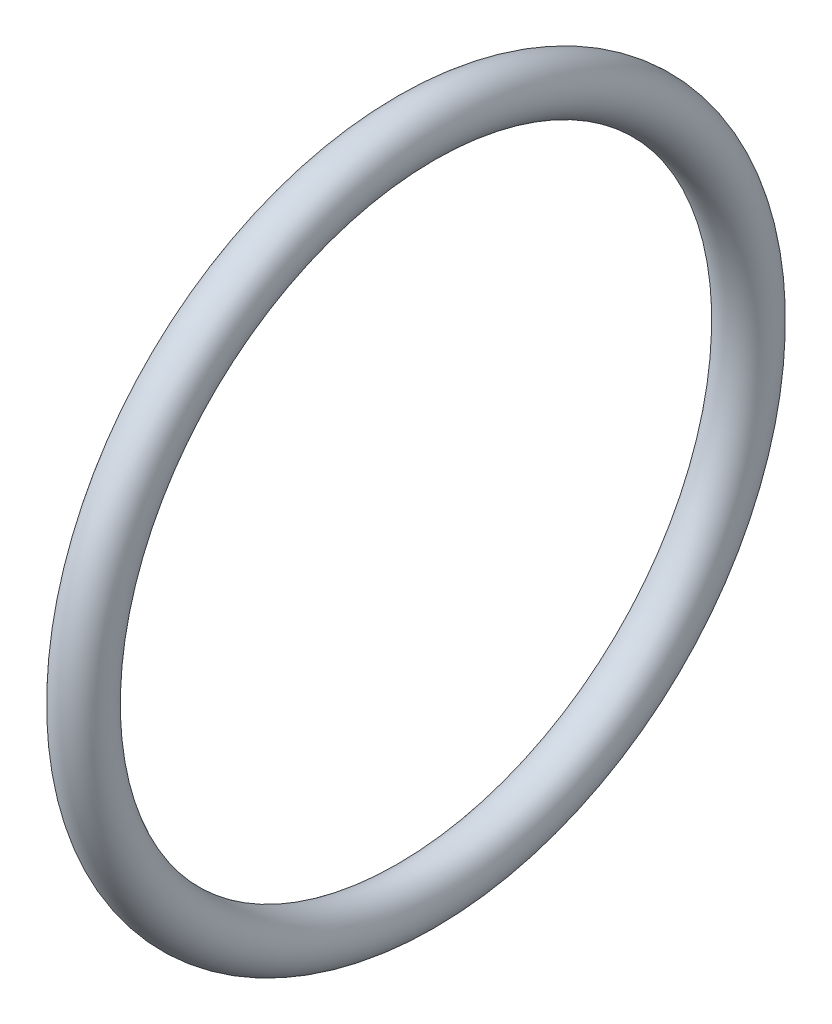
ISO-10303-21;
HEADER;
FILE_DESCRIPTION(('STEP AP214'),'2;1');
FILE_NAME('part.step','',(''),(''),'','','');
FILE_SCHEMA(('AUTOMOTIVE_DESIGN { 1 0 10303 214 1 1 1 1 }'));
ENDSEC;
DATA;
#1=APPLICATION_CONTEXT('core data for automotive mechanical design processes');
#2=APPLICATION_PROTOCOL_DEFINITION('international standard','automotive_design',2000,#1);
#3=PRODUCT_CONTEXT('',#1,'mechanical');
#4=PRODUCT('Part','Part','',(#3));
#5=PRODUCT_RELATED_PRODUCT_CATEGORY('part','',(#4));
#6=PRODUCT_DEFINITION_FORMATION('','',#4);
#7=PRODUCT_DEFINITION_CONTEXT('part definition',#1,'design');
#8=PRODUCT_DEFINITION('design','',#6,#7);
#9=PRODUCT_DEFINITION_SHAPE('','',#8);
#10=(LENGTH_UNIT() NAMED_UNIT(*) SI_UNIT(.MILLI.,.METRE.));
#11=(NAMED_UNIT(*) PLANE_ANGLE_UNIT() SI_UNIT($,.RADIAN.));
#12=(NAMED_UNIT(*) SI_UNIT($,.STERADIAN.) SOLID_ANGLE_UNIT());
#13=UNCERTAINTY_MEASURE_WITH_UNIT(LENGTH_MEASURE(1.E-05),#10,'distance_accuracy_value','');
#14=(GEOMETRIC_REPRESENTATION_CONTEXT(3) GLOBAL_UNCERTAINTY_ASSIGNED_CONTEXT((#13)) GLOBAL_UNIT_ASSIGNED_CONTEXT((#10,
#11,#12)) REPRESENTATION_CONTEXT('',''));
#15=CARTESIAN_POINT('',(0.,0.,0.));
#16=DIRECTION('',(0.,0.,1.));
#17=DIRECTION('',(1.,0.,0.));
#18=AXIS2_PLACEMENT_3D('',#15,#16,#17);
#19=CARTESIAN_POINT('',(0.,0.,0.));
#20=DIRECTION('',(1.,0.,0.));
#21=DIRECTION('',(0.,1.,0.));
#22=AXIS2_PLACEMENT_3D('',#19,#20,#21);
#23=TOROIDAL_SURFACE('',#22,25.5,2.);
#24=CARTESIAN_POINT('',(0.,27.5,0.));
#25=VERTEX_POINT('',#24);
#26=VERTEX_LOOP('',#25);
#27=FACE_BOUND('',#26,.T.);
#28=ADVANCED_FACE('F29',(#27),#23,.T.);
#29=CLOSED_SHELL('',(#28));
#30=MANIFOLD_SOLID_BREP('B2',#29);
#31=ADVANCED_BREP_SHAPE_REPRESENTATION('',(#18,#30),#14);
#32=SHAPE_DEFINITION_REPRESENTATION(#9,#31);
ENDSEC;
END-ISO-10303-21;
